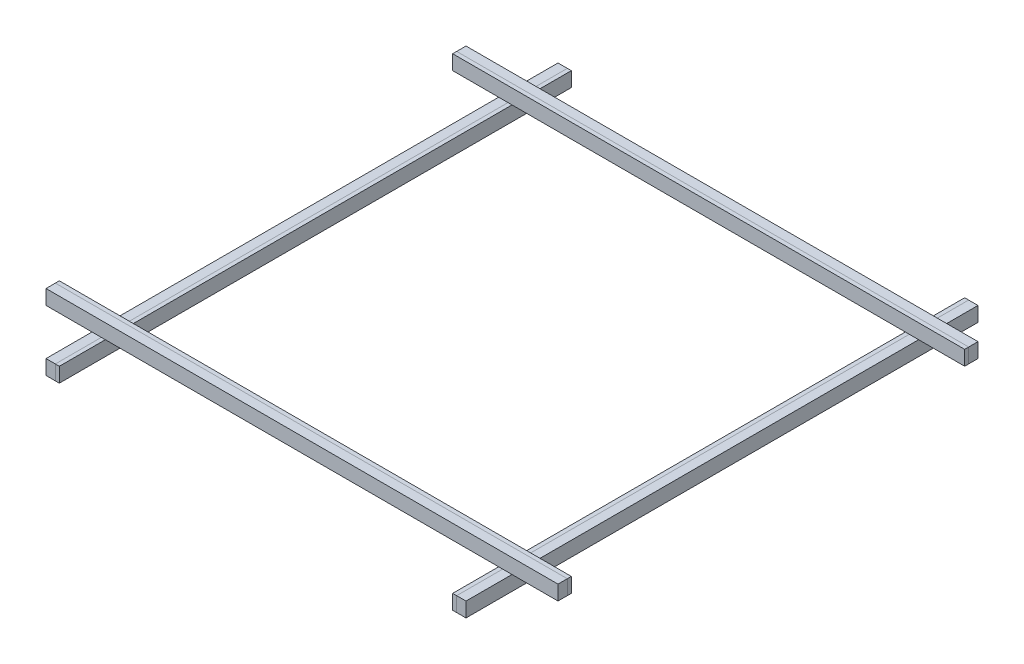
ISO-10303-21;
HEADER;
FILE_DESCRIPTION(('STEP AP214'),'2;1');
FILE_NAME('part.step','',(''),(''),'','','');
FILE_SCHEMA(('AUTOMOTIVE_DESIGN { 1 0 10303 214 1 1 1 1 }'));
ENDSEC;
DATA;
#1=APPLICATION_CONTEXT('core data for automotive mechanical design processes');
#2=APPLICATION_PROTOCOL_DEFINITION('international standard','automotive_design',2000,#1);
#3=PRODUCT_CONTEXT('',#1,'mechanical');
#4=PRODUCT('Part','Part','',(#3));
#5=PRODUCT_RELATED_PRODUCT_CATEGORY('part','',(#4));
#6=PRODUCT_DEFINITION_FORMATION('','',#4);
#7=PRODUCT_DEFINITION_CONTEXT('part definition',#1,'design');
#8=PRODUCT_DEFINITION('design','',#6,#7);
#9=PRODUCT_DEFINITION_SHAPE('','',#8);
#10=(LENGTH_UNIT() NAMED_UNIT(*) SI_UNIT(.MILLI.,.METRE.));
#11=(NAMED_UNIT(*) PLANE_ANGLE_UNIT() SI_UNIT($,.RADIAN.));
#12=(NAMED_UNIT(*) SI_UNIT($,.STERADIAN.) SOLID_ANGLE_UNIT());
#13=UNCERTAINTY_MEASURE_WITH_UNIT(LENGTH_MEASURE(1.E-05),#10,'distance_accuracy_value','');
#14=(GEOMETRIC_REPRESENTATION_CONTEXT(3) GLOBAL_UNCERTAINTY_ASSIGNED_CONTEXT((#13)) GLOBAL_UNIT_ASSIGNED_CONTEXT((#10,
#11,#12)) REPRESENTATION_CONTEXT('',''));
#15=CARTESIAN_POINT('',(0.,0.,0.));
#16=DIRECTION('',(0.,0.,1.));
#17=DIRECTION('',(1.,0.,0.));
#18=AXIS2_PLACEMENT_3D('',#15,#16,#17);
#19=CARTESIAN_POINT('',(3911.6,0.,-4876.8));
#20=DIRECTION('',(0.,0.,-1.));
#21=DIRECTION('',(-1.,0.,0.));
#22=AXIS2_PLACEMENT_3D('',#19,#20,#21);
#23=PLANE('',#22);
#24=DIRECTION('',(0.,1.,0.));
#25=VECTOR('',#24,1.);
#26=CARTESIAN_POINT('',(4044.95,-69.85,-4876.8));
#27=LINE('',#26,#25);
#28=CARTESIAN_POINT('',(4044.95,-69.85,-4876.8));
#29=VERTEX_POINT('',#28);
#30=CARTESIAN_POINT('',(4044.95,69.85,-4876.8));
#31=VERTEX_POINT('',#30);
#32=EDGE_CURVE('E91',#29,#31,#27,.T.);
#33=ORIENTED_EDGE('',*,*,#32,.F.);
#34=DIRECTION('',(1.,0.,0.));
#35=VECTOR('',#34,1.);
#36=CARTESIAN_POINT('',(4044.95,-69.85,-4876.8));
#37=LINE('',#36,#35);
#38=CARTESIAN_POINT('',(4006.85,-69.85,-4876.8));
#39=VERTEX_POINT('',#38);
#40=EDGE_CURVE('E115',#39,#29,#37,.T.);
#41=ORIENTED_EDGE('',*,*,#40,.F.);
#42=DIRECTION('',(0.,-1.,0.));
#43=VECTOR('',#42,1.);
#44=CARTESIAN_POINT('',(4006.85,-69.85,-4876.8));
#45=LINE('',#44,#43);
#46=CARTESIAN_POINT('',(4006.85,69.85,-4876.8));
#47=VERTEX_POINT('',#46);
#48=EDGE_CURVE('E134',#47,#39,#45,.T.);
#49=ORIENTED_EDGE('',*,*,#48,.F.);
#50=DIRECTION('',(-1.,0.,0.));
#51=VECTOR('',#50,1.);
#52=CARTESIAN_POINT('',(4044.95,69.85,-4876.8));
#53=LINE('',#52,#51);
#54=EDGE_CURVE('E128',#31,#47,#53,.T.);
#55=ORIENTED_EDGE('',*,*,#54,.F.);
#56=EDGE_LOOP('',(#33,#41,#49,#55));
#57=FACE_BOUND('',#56,.T.);
#58=ADVANCED_FACE('F72',(#57),#23,.T.);
#59=CARTESIAN_POINT('',(0.,0.,0.));
#60=DIRECTION('',(0.,0.,1.));
#61=DIRECTION('',(1.,0.,0.));
#62=AXIS2_PLACEMENT_3D('',#59,#60,#61);
#63=PLANE('',#62);
#64=DIRECTION('',(0.,1.,0.));
#65=VECTOR('',#64,1.);
#66=CARTESIAN_POINT('',(4044.95,-69.85,0.));
#67=LINE('',#66,#65);
#68=CARTESIAN_POINT('',(4044.95,-69.85,0.));
#69=VERTEX_POINT('',#68);
#70=CARTESIAN_POINT('',(4044.95,69.85,0.));
#71=VERTEX_POINT('',#70);
#72=EDGE_CURVE('E13',#69,#71,#67,.T.);
#73=ORIENTED_EDGE('',*,*,#72,.T.);
#74=DIRECTION('',(-1.,0.,0.));
#75=VECTOR('',#74,1.);
#76=CARTESIAN_POINT('',(4044.95,69.85,0.));
#77=LINE('',#76,#75);
#78=CARTESIAN_POINT('',(4006.85,69.85,0.));
#79=VERTEX_POINT('',#78);
#80=EDGE_CURVE('E82',#71,#79,#77,.T.);
#81=ORIENTED_EDGE('',*,*,#80,.T.);
#82=DIRECTION('',(0.,-1.,0.));
#83=VECTOR('',#82,1.);
#84=CARTESIAN_POINT('',(4006.85,-69.85,0.));
#85=LINE('',#84,#83);
#86=CARTESIAN_POINT('',(4006.85,-69.85,0.));
#87=VERTEX_POINT('',#86);
#88=EDGE_CURVE('E127',#79,#87,#85,.T.);
#89=ORIENTED_EDGE('',*,*,#88,.T.);
#90=DIRECTION('',(1.,0.,0.));
#91=VECTOR('',#90,1.);
#92=CARTESIAN_POINT('',(4044.95,-69.85,0.));
#93=LINE('',#92,#91);
#94=EDGE_CURVE('E76',#87,#69,#93,.T.);
#95=ORIENTED_EDGE('',*,*,#94,.T.);
#96=EDGE_LOOP('',(#73,#81,#89,#95));
#97=FACE_BOUND('',#96,.T.);
#98=ADVANCED_FACE('F74',(#97),#63,.T.);
#99=CARTESIAN_POINT('',(4044.95,69.85,-5021.60227898759));
#100=DIRECTION('',(0.,1.,0.));
#101=DIRECTION('',(-1.,0.,0.));
#102=AXIS2_PLACEMENT_3D('',#99,#100,#101);
#103=PLANE('',#102);
#104=DIRECTION('',(0.,0.,1.));
#105=VECTOR('',#104,1.);
#106=CARTESIAN_POINT('',(4044.95,69.85,-5021.60227898759));
#107=LINE('',#106,#105);
#108=EDGE_CURVE('E121',#31,#71,#107,.T.);
#109=ORIENTED_EDGE('',*,*,#108,.F.);
#110=ORIENTED_EDGE('',*,*,#54,.T.);
#111=DIRECTION('',(0.,0.,1.));
#112=VECTOR('',#111,1.);
#113=CARTESIAN_POINT('',(4006.85,69.85,-5021.60227898759));
#114=LINE('',#113,#112);
#115=EDGE_CURVE('E130',#47,#79,#114,.T.);
#116=ORIENTED_EDGE('',*,*,#115,.T.);
#117=ORIENTED_EDGE('',*,*,#80,.F.);
#118=EDGE_LOOP('',(#109,#110,#116,#117));
#119=FACE_BOUND('',#118,.T.);
#120=ADVANCED_FACE('F139',(#119),#103,.T.);
#121=CARTESIAN_POINT('',(4006.85,-69.85,-5021.60227898759));
#122=DIRECTION('',(-1.,0.,0.));
#123=DIRECTION('',(0.,0.,1.));
#124=AXIS2_PLACEMENT_3D('',#121,#122,#123);
#125=PLANE('',#124);
#126=ORIENTED_EDGE('',*,*,#115,.F.);
#127=ORIENTED_EDGE('',*,*,#48,.T.);
#128=DIRECTION('',(0.,0.,1.));
#129=VECTOR('',#128,1.);
#130=CARTESIAN_POINT('',(4006.85,-69.85,-5021.60227898759));
#131=LINE('',#130,#129);
#132=EDGE_CURVE('E144',#39,#87,#131,.T.);
#133=ORIENTED_EDGE('',*,*,#132,.T.);
#134=ORIENTED_EDGE('',*,*,#88,.F.);
#135=EDGE_LOOP('',(#126,#127,#133,#134));
#136=FACE_BOUND('',#135,.T.);
#137=ADVANCED_FACE('F143',(#136),#125,.T.);
#138=CARTESIAN_POINT('',(4044.95,-69.85,-5021.60227898759));
#139=DIRECTION('',(0.,-1.,0.));
#140=DIRECTION('',(0.,0.,-1.));
#141=AXIS2_PLACEMENT_3D('',#138,#139,#140);
#142=PLANE('',#141);
#143=ORIENTED_EDGE('',*,*,#132,.F.);
#144=ORIENTED_EDGE('',*,*,#40,.T.);
#145=DIRECTION('',(0.,0.,1.));
#146=VECTOR('',#145,1.);
#147=CARTESIAN_POINT('',(4044.95,-69.85,-5021.60227898759));
#148=LINE('',#147,#146);
#149=EDGE_CURVE('E110',#29,#69,#148,.T.);
#150=ORIENTED_EDGE('',*,*,#149,.T.);
#151=ORIENTED_EDGE('',*,*,#94,.F.);
#152=EDGE_LOOP('',(#143,#144,#150,#151));
#153=FACE_BOUND('',#152,.T.);
#154=ADVANCED_FACE('F113',(#153),#142,.T.);
#155=CARTESIAN_POINT('',(4044.95,-69.85,-5021.60227898759));
#156=DIRECTION('',(1.,0.,0.));
#157=DIRECTION('',(0.,0.,-1.));
#158=AXIS2_PLACEMENT_3D('',#155,#156,#157);
#159=PLANE('',#158);
#160=ORIENTED_EDGE('',*,*,#149,.F.);
#161=ORIENTED_EDGE('',*,*,#32,.T.);
#162=ORIENTED_EDGE('',*,*,#108,.T.);
#163=ORIENTED_EDGE('',*,*,#72,.F.);
#164=EDGE_LOOP('',(#160,#161,#162,#163));
#165=FACE_BOUND('',#164,.T.);
#166=ADVANCED_FACE('F119',(#165),#159,.T.);
#167=CLOSED_SHELL('',(#58,#98,#120,#137,#154,#166));
#168=MANIFOLD_SOLID_BREP('B2',#167);
#169=CARTESIAN_POINT('',(3911.6,0.,-4876.8));
#170=DIRECTION('',(0.,0.,-1.));
#171=DIRECTION('',(-1.,0.,0.));
#172=AXIS2_PLACEMENT_3D('',#169,#170,#171);
#173=PLANE('',#172);
#174=DIRECTION('',(0.,-1.,0.));
#175=VECTOR('',#174,1.);
#176=CARTESIAN_POINT('',(222.25,-69.85,-4876.8));
#177=LINE('',#176,#175);
#178=CARTESIAN_POINT('',(222.25,69.85,-4876.8));
#179=VERTEX_POINT('',#178);
#180=CARTESIAN_POINT('',(222.25,-69.85,-4876.8));
#181=VERTEX_POINT('',#180);
#182=EDGE_CURVE('E231',#179,#181,#177,.T.);
#183=ORIENTED_EDGE('',*,*,#182,.F.);
#184=DIRECTION('',(-1.,0.,0.));
#185=VECTOR('',#184,1.);
#186=CARTESIAN_POINT('',(222.25,69.85,-4876.8));
#187=LINE('',#186,#185);
#188=CARTESIAN_POINT('',(260.35,69.85,-4876.8));
#189=VERTEX_POINT('',#188);
#190=EDGE_CURVE('E254',#189,#179,#187,.T.);
#191=ORIENTED_EDGE('',*,*,#190,.F.);
#192=DIRECTION('',(0.,1.,0.));
#193=VECTOR('',#192,1.);
#194=CARTESIAN_POINT('',(260.35,-69.85,-4876.8));
#195=LINE('',#194,#193);
#196=CARTESIAN_POINT('',(260.35,-69.85,-4876.8));
#197=VERTEX_POINT('',#196);
#198=EDGE_CURVE('E259',#197,#189,#195,.T.);
#199=ORIENTED_EDGE('',*,*,#198,.F.);
#200=DIRECTION('',(1.,0.,0.));
#201=VECTOR('',#200,1.);
#202=CARTESIAN_POINT('',(222.25,-69.85,-4876.8));
#203=LINE('',#202,#201);
#204=EDGE_CURVE('E274',#181,#197,#203,.T.);
#205=ORIENTED_EDGE('',*,*,#204,.F.);
#206=EDGE_LOOP('',(#183,#191,#199,#205));
#207=FACE_BOUND('',#206,.T.);
#208=ADVANCED_FACE('F222',(#207),#173,.T.);
#209=CARTESIAN_POINT('',(0.,0.,0.));
#210=DIRECTION('',(0.,0.,-1.));
#211=DIRECTION('',(-1.,0.,0.));
#212=AXIS2_PLACEMENT_3D('',#209,#210,#211);
#213=PLANE('',#212);
#214=DIRECTION('',(0.,-1.,0.));
#215=VECTOR('',#214,1.);
#216=CARTESIAN_POINT('',(222.25,-69.85,0.));
#217=LINE('',#216,#215);
#218=CARTESIAN_POINT('',(222.25,69.85,0.));
#219=VERTEX_POINT('',#218);
#220=CARTESIAN_POINT('',(222.25,-69.85,0.));
#221=VERTEX_POINT('',#220);
#222=EDGE_CURVE('E284',#219,#221,#217,.T.);
#223=ORIENTED_EDGE('',*,*,#222,.T.);
#224=DIRECTION('',(1.,0.,0.));
#225=VECTOR('',#224,1.);
#226=CARTESIAN_POINT('',(222.25,-69.85,0.));
#227=LINE('',#226,#225);
#228=CARTESIAN_POINT('',(260.35,-69.85,0.));
#229=VERTEX_POINT('',#228);
#230=EDGE_CURVE('E272',#221,#229,#227,.T.);
#231=ORIENTED_EDGE('',*,*,#230,.T.);
#232=DIRECTION('',(0.,1.,0.));
#233=VECTOR('',#232,1.);
#234=CARTESIAN_POINT('',(260.35,-69.85,0.));
#235=LINE('',#234,#233);
#236=CARTESIAN_POINT('',(260.35,69.85,0.));
#237=VERTEX_POINT('',#236);
#238=EDGE_CURVE('E276',#229,#237,#235,.T.);
#239=ORIENTED_EDGE('',*,*,#238,.T.);
#240=DIRECTION('',(-1.,0.,0.));
#241=VECTOR('',#240,1.);
#242=CARTESIAN_POINT('',(222.25,69.85,0.));
#243=LINE('',#242,#241);
#244=EDGE_CURVE('E281',#237,#219,#243,.T.);
#245=ORIENTED_EDGE('',*,*,#244,.T.);
#246=EDGE_LOOP('',(#223,#231,#239,#245));
#247=FACE_BOUND('',#246,.T.);
#248=ADVANCED_FACE('F283',(#247),#213,.F.);
#249=CARTESIAN_POINT('',(222.25,-69.85,-5021.60227898759));
#250=DIRECTION('',(0.,-1.,0.));
#251=DIRECTION('',(0.,0.,-1.));
#252=AXIS2_PLACEMENT_3D('',#249,#250,#251);
#253=PLANE('',#252);
#254=DIRECTION('',(0.,0.,1.));
#255=VECTOR('',#254,1.);
#256=CARTESIAN_POINT('',(222.25,-69.85,-5021.60227898759));
#257=LINE('',#256,#255);
#258=EDGE_CURVE('E70',#181,#221,#257,.T.);
#259=ORIENTED_EDGE('',*,*,#258,.F.);
#260=ORIENTED_EDGE('',*,*,#204,.T.);
#261=DIRECTION('',(0.,0.,1.));
#262=VECTOR('',#261,1.);
#263=CARTESIAN_POINT('',(260.35,-69.85,-5021.60227898759));
#264=LINE('',#263,#262);
#265=EDGE_CURVE('E269',#197,#229,#264,.T.);
#266=ORIENTED_EDGE('',*,*,#265,.T.);
#267=ORIENTED_EDGE('',*,*,#230,.F.);
#268=EDGE_LOOP('',(#259,#260,#266,#267));
#269=FACE_BOUND('',#268,.T.);
#270=ADVANCED_FACE('F270',(#269),#253,.T.);
#271=CARTESIAN_POINT('',(260.35,-69.85,-5021.60227898759));
#272=DIRECTION('',(1.,0.,0.));
#273=DIRECTION('',(0.,1.,0.));
#274=AXIS2_PLACEMENT_3D('',#271,#272,#273);
#275=PLANE('',#274);
#276=ORIENTED_EDGE('',*,*,#265,.F.);
#277=ORIENTED_EDGE('',*,*,#198,.T.);
#278=DIRECTION('',(0.,0.,1.));
#279=VECTOR('',#278,1.);
#280=CARTESIAN_POINT('',(260.35,69.85,-5021.60227898759));
#281=LINE('',#280,#279);
#282=EDGE_CURVE('E264',#189,#237,#281,.T.);
#283=ORIENTED_EDGE('',*,*,#282,.T.);
#284=ORIENTED_EDGE('',*,*,#238,.F.);
#285=EDGE_LOOP('',(#276,#277,#283,#284));
#286=FACE_BOUND('',#285,.T.);
#287=ADVANCED_FACE('F277',(#286),#275,.T.);
#288=CARTESIAN_POINT('',(222.25,69.85,-5021.60227898759));
#289=DIRECTION('',(0.,1.,0.));
#290=DIRECTION('',(0.,0.,1.));
#291=AXIS2_PLACEMENT_3D('',#288,#289,#290);
#292=PLANE('',#291);
#293=ORIENTED_EDGE('',*,*,#282,.F.);
#294=ORIENTED_EDGE('',*,*,#190,.T.);
#295=DIRECTION('',(0.,0.,1.));
#296=VECTOR('',#295,1.);
#297=CARTESIAN_POINT('',(222.25,69.85,-5021.60227898759));
#298=LINE('',#297,#296);
#299=EDGE_CURVE('E291',#179,#219,#298,.T.);
#300=ORIENTED_EDGE('',*,*,#299,.T.);
#301=ORIENTED_EDGE('',*,*,#244,.F.);
#302=EDGE_LOOP('',(#293,#294,#300,#301));
#303=FACE_BOUND('',#302,.T.);
#304=ADVANCED_FACE('F299',(#303),#292,.T.);
#305=CARTESIAN_POINT('',(222.25,-69.85,-5021.60227898759));
#306=DIRECTION('',(-1.,0.,0.));
#307=DIRECTION('',(0.,0.,1.));
#308=AXIS2_PLACEMENT_3D('',#305,#306,#307);
#309=PLANE('',#308);
#310=ORIENTED_EDGE('',*,*,#299,.F.);
#311=ORIENTED_EDGE('',*,*,#182,.T.);
#312=ORIENTED_EDGE('',*,*,#258,.T.);
#313=ORIENTED_EDGE('',*,*,#222,.F.);
#314=EDGE_LOOP('',(#310,#311,#312,#313));
#315=FACE_BOUND('',#314,.T.);
#316=ADVANCED_FACE('F300',(#315),#309,.T.);
#317=CLOSED_SHELL('',(#208,#248,#270,#287,#304,#316));
#318=MANIFOLD_SOLID_BREP('B7',#317);
#319=CARTESIAN_POINT('',(4572.,139.7,-660.399999999999));
#320=DIRECTION('',(1.,0.,0.));
#321=DIRECTION('',(0.,0.,-1.));
#322=AXIS2_PLACEMENT_3D('',#319,#320,#321);
#323=PLANE('',#322);
#324=DIRECTION('',(0.,1.,0.));
#325=VECTOR('',#324,1.);
#326=CARTESIAN_POINT('',(4572.,209.55,-527.049999999999));
#327=LINE('',#326,#325);
#328=CARTESIAN_POINT('',(4572.,69.85,-527.049999999999));
#329=VERTEX_POINT('',#328);
#330=CARTESIAN_POINT('',(4572.,209.55,-527.049999999999));
#331=VERTEX_POINT('',#330);
#332=EDGE_CURVE('E391',#329,#331,#327,.T.);
#333=ORIENTED_EDGE('',*,*,#332,.F.);
#334=DIRECTION('',(0.,0.,1.));
#335=VECTOR('',#334,1.);
#336=CARTESIAN_POINT('',(4572.,69.85,-527.049999999999));
#337=LINE('',#336,#335);
#338=CARTESIAN_POINT('',(4572.,69.85,-565.149999999999));
#339=VERTEX_POINT('',#338);
#340=EDGE_CURVE('E415',#339,#329,#337,.T.);
#341=ORIENTED_EDGE('',*,*,#340,.F.);
#342=DIRECTION('',(0.,-1.,0.));
#343=VECTOR('',#342,1.);
#344=CARTESIAN_POINT('',(4572.,209.55,-565.149999999999));
#345=LINE('',#344,#343);
#346=CARTESIAN_POINT('',(4572.,209.55,-565.149999999999));
#347=VERTEX_POINT('',#346);
#348=EDGE_CURVE('E432',#347,#339,#345,.T.);
#349=ORIENTED_EDGE('',*,*,#348,.F.);
#350=DIRECTION('',(0.,0.,-1.));
#351=VECTOR('',#350,1.);
#352=CARTESIAN_POINT('',(4572.,209.55,-527.049999999999));
#353=LINE('',#352,#351);
#354=EDGE_CURVE('E427',#331,#347,#353,.T.);
#355=ORIENTED_EDGE('',*,*,#354,.F.);
#356=EDGE_LOOP('',(#333,#341,#349,#355));
#357=FACE_BOUND('',#356,.T.);
#358=ADVANCED_FACE('F372',(#357),#323,.T.);
#359=CARTESIAN_POINT('',(-304.8,0.,0.));
#360=DIRECTION('',(1.,0.,0.));
#361=DIRECTION('',(0.,0.,-1.));
#362=AXIS2_PLACEMENT_3D('',#359,#360,#361);
#363=PLANE('',#362);
#364=DIRECTION('',(0.,1.,0.));
#365=VECTOR('',#364,1.);
#366=CARTESIAN_POINT('',(-304.8,209.55,-527.049999999999));
#367=LINE('',#366,#365);
#368=CARTESIAN_POINT('',(-304.8,69.85,-527.049999999999));
#369=VERTEX_POINT('',#368);
#370=CARTESIAN_POINT('',(-304.8,209.55,-527.049999999999));
#371=VERTEX_POINT('',#370);
#372=EDGE_CURVE('E220',#369,#371,#367,.T.);
#373=ORIENTED_EDGE('',*,*,#372,.T.);
#374=DIRECTION('',(0.,0.,-1.));
#375=VECTOR('',#374,1.);
#376=CARTESIAN_POINT('',(-304.8,209.55,-527.049999999999));
#377=LINE('',#376,#375);
#378=CARTESIAN_POINT('',(-304.8,209.55,-565.149999999999));
#379=VERTEX_POINT('',#378);
#380=EDGE_CURVE('E382',#371,#379,#377,.T.);
#381=ORIENTED_EDGE('',*,*,#380,.T.);
#382=DIRECTION('',(0.,-1.,0.));
#383=VECTOR('',#382,1.);
#384=CARTESIAN_POINT('',(-304.8,209.55,-565.149999999999));
#385=LINE('',#384,#383);
#386=CARTESIAN_POINT('',(-304.8,69.85,-565.149999999999));
#387=VERTEX_POINT('',#386);
#388=EDGE_CURVE('E426',#379,#387,#385,.T.);
#389=ORIENTED_EDGE('',*,*,#388,.T.);
#390=DIRECTION('',(0.,0.,1.));
#391=VECTOR('',#390,1.);
#392=CARTESIAN_POINT('',(-304.8,69.85,-527.049999999999));
#393=LINE('',#392,#391);
#394=EDGE_CURVE('E376',#387,#369,#393,.T.);
#395=ORIENTED_EDGE('',*,*,#394,.T.);
#396=EDGE_LOOP('',(#373,#381,#389,#395));
#397=FACE_BOUND('',#396,.T.);
#398=ADVANCED_FACE('F374',(#397),#363,.F.);
#399=CARTESIAN_POINT('',(4716.80227898759,209.55,-527.049999999999));
#400=DIRECTION('',(0.,1.,0.));
#401=DIRECTION('',(0.,0.,1.));
#402=AXIS2_PLACEMENT_3D('',#399,#400,#401);
#403=PLANE('',#402);
#404=DIRECTION('',(-1.,0.,0.));
#405=VECTOR('',#404,1.);
#406=CARTESIAN_POINT('',(4716.80227898759,209.55,-527.049999999999));
#407=LINE('',#406,#405);
#408=EDGE_CURVE('E420',#331,#371,#407,.T.);
#409=ORIENTED_EDGE('',*,*,#408,.F.);
#410=ORIENTED_EDGE('',*,*,#354,.T.);
#411=DIRECTION('',(-1.,0.,0.));
#412=VECTOR('',#411,1.);
#413=CARTESIAN_POINT('',(4716.80227898759,209.55,-565.149999999999));
#414=LINE('',#413,#412);
#415=EDGE_CURVE('E429',#347,#379,#414,.T.);
#416=ORIENTED_EDGE('',*,*,#415,.T.);
#417=ORIENTED_EDGE('',*,*,#380,.F.);
#418=EDGE_LOOP('',(#409,#410,#416,#417));
#419=FACE_BOUND('',#418,.T.);
#420=ADVANCED_FACE('F437',(#419),#403,.T.);
#421=CARTESIAN_POINT('',(4716.80227898759,209.55,-565.149999999999));
#422=DIRECTION('',(0.,0.,-1.));
#423=DIRECTION('',(-1.,0.,0.));
#424=AXIS2_PLACEMENT_3D('',#421,#422,#423);
#425=PLANE('',#424);
#426=ORIENTED_EDGE('',*,*,#415,.F.);
#427=ORIENTED_EDGE('',*,*,#348,.T.);
#428=DIRECTION('',(-1.,0.,0.));
#429=VECTOR('',#428,1.);
#430=CARTESIAN_POINT('',(4716.80227898759,69.85,-565.149999999999));
#431=LINE('',#430,#429);
#432=EDGE_CURVE('E442',#339,#387,#431,.T.);
#433=ORIENTED_EDGE('',*,*,#432,.T.);
#434=ORIENTED_EDGE('',*,*,#388,.F.);
#435=EDGE_LOOP('',(#426,#427,#433,#434));
#436=FACE_BOUND('',#435,.T.);
#437=ADVANCED_FACE('F441',(#436),#425,.T.);
#438=CARTESIAN_POINT('',(4716.80227898759,69.85,-527.049999999999));
#439=DIRECTION('',(0.,-1.,0.));
#440=DIRECTION('',(0.,0.,-1.));
#441=AXIS2_PLACEMENT_3D('',#438,#439,#440);
#442=PLANE('',#441);
#443=ORIENTED_EDGE('',*,*,#432,.F.);
#444=ORIENTED_EDGE('',*,*,#340,.T.);
#445=DIRECTION('',(-1.,0.,0.));
#446=VECTOR('',#445,1.);
#447=CARTESIAN_POINT('',(4716.80227898759,69.85,-527.049999999999));
#448=LINE('',#447,#446);
#449=EDGE_CURVE('E410',#329,#369,#448,.T.);
#450=ORIENTED_EDGE('',*,*,#449,.T.);
#451=ORIENTED_EDGE('',*,*,#394,.F.);
#452=EDGE_LOOP('',(#443,#444,#450,#451));
#453=FACE_BOUND('',#452,.T.);
#454=ADVANCED_FACE('F413',(#453),#442,.T.);
#455=CARTESIAN_POINT('',(4716.80227898759,209.55,-527.049999999999));
#456=DIRECTION('',(0.,0.,1.));
#457=DIRECTION('',(1.,0.,0.));
#458=AXIS2_PLACEMENT_3D('',#455,#456,#457);
#459=PLANE('',#458);
#460=ORIENTED_EDGE('',*,*,#449,.F.);
#461=ORIENTED_EDGE('',*,*,#332,.T.);
#462=ORIENTED_EDGE('',*,*,#408,.T.);
#463=ORIENTED_EDGE('',*,*,#372,.F.);
#464=EDGE_LOOP('',(#460,#461,#462,#463));
#465=FACE_BOUND('',#464,.T.);
#466=ADVANCED_FACE('F418',(#465),#459,.T.);
#467=CLOSED_SHELL('',(#358,#398,#420,#437,#454,#466));
#468=MANIFOLD_SOLID_BREP('B64',#467);
#469=CARTESIAN_POINT('',(4572.,139.7,-660.399999999999));
#470=DIRECTION('',(1.,0.,0.));
#471=DIRECTION('',(0.,0.,-1.));
#472=AXIS2_PLACEMENT_3D('',#469,#470,#471);
#473=PLANE('',#472);
#474=DIRECTION('',(0.,-1.,0.));
#475=VECTOR('',#474,1.);
#476=CARTESIAN_POINT('',(4572.,209.55,-4349.75));
#477=LINE('',#476,#475);
#478=CARTESIAN_POINT('',(4572.,209.55,-4349.75));
#479=VERTEX_POINT('',#478);
#480=CARTESIAN_POINT('',(4572.,69.85,-4349.75));
#481=VERTEX_POINT('',#480);
#482=EDGE_CURVE('E527',#479,#481,#477,.T.);
#483=ORIENTED_EDGE('',*,*,#482,.F.);
#484=DIRECTION('',(0.,0.,-1.));
#485=VECTOR('',#484,1.);
#486=CARTESIAN_POINT('',(4572.,209.55,-4349.75));
#487=LINE('',#486,#485);
#488=CARTESIAN_POINT('',(4572.,209.55,-4311.65));
#489=VERTEX_POINT('',#488);
#490=EDGE_CURVE('E554',#489,#479,#487,.T.);
#491=ORIENTED_EDGE('',*,*,#490,.F.);
#492=DIRECTION('',(0.,1.,0.));
#493=VECTOR('',#492,1.);
#494=CARTESIAN_POINT('',(4572.,209.55,-4311.65));
#495=LINE('',#494,#493);
#496=CARTESIAN_POINT('',(4572.,69.85,-4311.65));
#497=VERTEX_POINT('',#496);
#498=EDGE_CURVE('E559',#497,#489,#495,.T.);
#499=ORIENTED_EDGE('',*,*,#498,.F.);
#500=DIRECTION('',(0.,0.,1.));
#501=VECTOR('',#500,1.);
#502=CARTESIAN_POINT('',(4572.,69.85,-4349.75));
#503=LINE('',#502,#501);
#504=EDGE_CURVE('E574',#481,#497,#503,.T.);
#505=ORIENTED_EDGE('',*,*,#504,.F.);
#506=EDGE_LOOP('',(#483,#491,#499,#505));
#507=FACE_BOUND('',#506,.T.);
#508=ADVANCED_FACE('F518',(#507),#473,.T.);
#509=CARTESIAN_POINT('',(-304.8,0.,0.));
#510=DIRECTION('',(-1.,0.,0.));
#511=DIRECTION('',(0.,0.,1.));
#512=AXIS2_PLACEMENT_3D('',#509,#510,#511);
#513=PLANE('',#512);
#514=DIRECTION('',(0.,-1.,0.));
#515=VECTOR('',#514,1.);
#516=CARTESIAN_POINT('',(-304.8,209.55,-4349.75));
#517=LINE('',#516,#515);
#518=CARTESIAN_POINT('',(-304.8,209.55,-4349.75));
#519=VERTEX_POINT('',#518);
#520=CARTESIAN_POINT('',(-304.8,69.85,-4349.75));
#521=VERTEX_POINT('',#520);
#522=EDGE_CURVE('E585',#519,#521,#517,.T.);
#523=ORIENTED_EDGE('',*,*,#522,.T.);
#524=DIRECTION('',(0.,0.,1.));
#525=VECTOR('',#524,1.);
#526=CARTESIAN_POINT('',(-304.8,69.85,-4349.75));
#527=LINE('',#526,#525);
#528=CARTESIAN_POINT('',(-304.8,69.85,-4311.65));
#529=VERTEX_POINT('',#528);
#530=EDGE_CURVE('E572',#521,#529,#527,.T.);
#531=ORIENTED_EDGE('',*,*,#530,.T.);
#532=DIRECTION('',(0.,1.,0.));
#533=VECTOR('',#532,1.);
#534=CARTESIAN_POINT('',(-304.8,209.55,-4311.65));
#535=LINE('',#534,#533);
#536=CARTESIAN_POINT('',(-304.8,209.55,-4311.65));
#537=VERTEX_POINT('',#536);
#538=EDGE_CURVE('E576',#529,#537,#535,.T.);
#539=ORIENTED_EDGE('',*,*,#538,.T.);
#540=DIRECTION('',(0.,0.,-1.));
#541=VECTOR('',#540,1.);
#542=CARTESIAN_POINT('',(-304.8,209.55,-4349.75));
#543=LINE('',#542,#541);
#544=EDGE_CURVE('E582',#537,#519,#543,.T.);
#545=ORIENTED_EDGE('',*,*,#544,.T.);
#546=EDGE_LOOP('',(#523,#531,#539,#545));
#547=FACE_BOUND('',#546,.T.);
#548=ADVANCED_FACE('F584',(#547),#513,.T.);
#549=CARTESIAN_POINT('',(4716.80227898759,69.85,-4349.75));
#550=DIRECTION('',(0.,-1.,0.));
#551=DIRECTION('',(0.,0.,-1.));
#552=AXIS2_PLACEMENT_3D('',#549,#550,#551);
#553=PLANE('',#552);
#554=DIRECTION('',(-1.,0.,0.));
#555=VECTOR('',#554,1.);
#556=CARTESIAN_POINT('',(4716.80227898759,69.85,-4349.75));
#557=LINE('',#556,#555);
#558=EDGE_CURVE('E370',#481,#521,#557,.T.);
#559=ORIENTED_EDGE('',*,*,#558,.F.);
#560=ORIENTED_EDGE('',*,*,#504,.T.);
#561=DIRECTION('',(-1.,0.,0.));
#562=VECTOR('',#561,1.);
#563=CARTESIAN_POINT('',(4716.80227898759,69.85,-4311.65));
#564=LINE('',#563,#562);
#565=EDGE_CURVE('E569',#497,#529,#564,.T.);
#566=ORIENTED_EDGE('',*,*,#565,.T.);
#567=ORIENTED_EDGE('',*,*,#530,.F.);
#568=EDGE_LOOP('',(#559,#560,#566,#567));
#569=FACE_BOUND('',#568,.T.);
#570=ADVANCED_FACE('F570',(#569),#553,.T.);
#571=CARTESIAN_POINT('',(4716.80227898759,209.55,-4311.65));
#572=DIRECTION('',(0.,0.,1.));
#573=DIRECTION('',(1.,0.,0.));
#574=AXIS2_PLACEMENT_3D('',#571,#572,#573);
#575=PLANE('',#574);
#576=ORIENTED_EDGE('',*,*,#565,.F.);
#577=ORIENTED_EDGE('',*,*,#498,.T.);
#578=DIRECTION('',(-1.,0.,0.));
#579=VECTOR('',#578,1.);
#580=CARTESIAN_POINT('',(4716.80227898759,209.55,-4311.65));
#581=LINE('',#580,#579);
#582=EDGE_CURVE('E564',#489,#537,#581,.T.);
#583=ORIENTED_EDGE('',*,*,#582,.T.);
#584=ORIENTED_EDGE('',*,*,#538,.F.);
#585=EDGE_LOOP('',(#576,#577,#583,#584));
#586=FACE_BOUND('',#585,.T.);
#587=ADVANCED_FACE('F577',(#586),#575,.T.);
#588=CARTESIAN_POINT('',(4716.80227898759,209.55,-4349.75));
#589=DIRECTION('',(0.,1.,0.));
#590=DIRECTION('',(0.,0.,1.));
#591=AXIS2_PLACEMENT_3D('',#588,#589,#590);
#592=PLANE('',#591);
#593=ORIENTED_EDGE('',*,*,#582,.F.);
#594=ORIENTED_EDGE('',*,*,#490,.T.);
#595=DIRECTION('',(-1.,0.,0.));
#596=VECTOR('',#595,1.);
#597=CARTESIAN_POINT('',(4716.80227898759,209.55,-4349.75));
#598=LINE('',#597,#596);
#599=EDGE_CURVE('E595',#479,#519,#598,.T.);
#600=ORIENTED_EDGE('',*,*,#599,.T.);
#601=ORIENTED_EDGE('',*,*,#544,.F.);
#602=EDGE_LOOP('',(#593,#594,#600,#601));
#603=FACE_BOUND('',#602,.T.);
#604=ADVANCED_FACE('F605',(#603),#592,.T.);
#605=CARTESIAN_POINT('',(4716.80227898759,209.55,-4349.75));
#606=DIRECTION('',(0.,0.,-1.));
#607=DIRECTION('',(-1.,0.,0.));
#608=AXIS2_PLACEMENT_3D('',#605,#606,#607);
#609=PLANE('',#608);
#610=ORIENTED_EDGE('',*,*,#599,.F.);
#611=ORIENTED_EDGE('',*,*,#482,.T.);
#612=ORIENTED_EDGE('',*,*,#558,.T.);
#613=ORIENTED_EDGE('',*,*,#522,.F.);
#614=EDGE_LOOP('',(#610,#611,#612,#613));
#615=FACE_BOUND('',#614,.T.);
#616=ADVANCED_FACE('F606',(#615),#609,.T.);
#617=CLOSED_SHELL('',(#508,#548,#570,#587,#604,#616));
#618=MANIFOLD_SOLID_BREP('B214',#617);
#619=CARTESIAN_POINT('',(4572.,209.55,-527.049999999999));
#620=DIRECTION('',(0.,0.,1.));
#621=DIRECTION('',(1.,0.,0.));
#622=AXIS2_PLACEMENT_3D('',#619,#620,#621);
#623=PLANE('',#622);
#624=DIRECTION('',(0.,1.,0.));
#625=VECTOR('',#624,1.);
#626=CARTESIAN_POINT('',(-304.8,209.55,-527.049999999999));
#627=LINE('',#626,#625);
#628=CARTESIAN_POINT('',(-304.8,69.85,-527.049999999999));
#629=VERTEX_POINT('',#628);
#630=CARTESIAN_POINT('',(-304.8,209.55,-527.049999999999));
#631=VERTEX_POINT('',#630);
#632=EDGE_CURVE('E743',#629,#631,#627,.T.);
#633=ORIENTED_EDGE('',*,*,#632,.T.);
#634=DIRECTION('',(-1.,0.,0.));
#635=VECTOR('',#634,1.);
#636=CARTESIAN_POINT('',(4572.,209.55,-527.049999999999));
#637=LINE('',#636,#635);
#638=CARTESIAN_POINT('',(4572.,209.55,-527.049999999999));
#639=VERTEX_POINT('',#638);
#640=EDGE_CURVE('E516',#639,#631,#637,.T.);
#641=ORIENTED_EDGE('',*,*,#640,.F.);
#642=DIRECTION('',(0.,1.,0.));
#643=VECTOR('',#642,1.);
#644=CARTESIAN_POINT('',(4572.,209.55,-527.049999999999));
#645=LINE('',#644,#643);
#646=CARTESIAN_POINT('',(4572.,69.85,-527.049999999999));
#647=VERTEX_POINT('',#646);
#648=EDGE_CURVE('E731',#647,#639,#645,.T.);
#649=ORIENTED_EDGE('',*,*,#648,.F.);
#650=DIRECTION('',(-1.,0.,0.));
#651=VECTOR('',#650,1.);
#652=CARTESIAN_POINT('',(4572.,69.85,-527.049999999999));
#653=LINE('',#652,#651);
#654=EDGE_CURVE('E739',#647,#629,#653,.T.);
#655=ORIENTED_EDGE('',*,*,#654,.T.);
#656=EDGE_LOOP('',(#633,#641,#649,#655));
#657=FACE_BOUND('',#656,.T.);
#658=ADVANCED_FACE('F680',(#657),#623,.F.);
#659=CARTESIAN_POINT('',(4572.,209.55,-438.149999999999));
#660=DIRECTION('',(0.,-1.,0.));
#661=DIRECTION('',(0.,0.,-1.));
#662=AXIS2_PLACEMENT_3D('',#659,#660,#661);
#663=PLANE('',#662);
#664=DIRECTION('',(0.,0.,1.));
#665=VECTOR('',#664,1.);
#666=CARTESIAN_POINT('',(-304.8,209.55,-438.149999999999));
#667=LINE('',#666,#665);
#668=CARTESIAN_POINT('',(-304.8,209.55,-438.149999999999));
#669=VERTEX_POINT('',#668);
#670=EDGE_CURVE('E735',#631,#669,#667,.T.);
#671=ORIENTED_EDGE('',*,*,#670,.T.);
#672=DIRECTION('',(-1.,0.,0.));
#673=VECTOR('',#672,1.);
#674=CARTESIAN_POINT('',(4572.,209.55,-438.149999999999));
#675=LINE('',#674,#673);
#676=CARTESIAN_POINT('',(4572.,209.55,-438.149999999999));
#677=VERTEX_POINT('',#676);
#678=EDGE_CURVE('E688',#677,#669,#675,.T.);
#679=ORIENTED_EDGE('',*,*,#678,.F.);
#680=DIRECTION('',(0.,0.,1.));
#681=VECTOR('',#680,1.);
#682=CARTESIAN_POINT('',(4572.,209.55,-438.149999999999));
#683=LINE('',#682,#681);
#684=EDGE_CURVE('E726',#639,#677,#683,.T.);
#685=ORIENTED_EDGE('',*,*,#684,.F.);
#686=ORIENTED_EDGE('',*,*,#640,.T.);
#687=EDGE_LOOP('',(#671,#679,#685,#686));
#688=FACE_BOUND('',#687,.T.);
#689=ADVANCED_FACE('F734',(#688),#663,.F.);
#690=CARTESIAN_POINT('',(4572.,209.55,-438.149999999999));
#691=DIRECTION('',(0.,0.,-1.));
#692=DIRECTION('',(-1.,0.,0.));
#693=AXIS2_PLACEMENT_3D('',#690,#691,#692);
#694=PLANE('',#693);
#695=DIRECTION('',(0.,-1.,0.));
#696=VECTOR('',#695,1.);
#697=CARTESIAN_POINT('',(-304.8,209.55,-438.149999999999));
#698=LINE('',#697,#696);
#699=CARTESIAN_POINT('',(-304.8,69.85,-438.149999999999));
#700=VERTEX_POINT('',#699);
#701=EDGE_CURVE('E713',#669,#700,#698,.T.);
#702=ORIENTED_EDGE('',*,*,#701,.T.);
#703=DIRECTION('',(-1.,0.,0.));
#704=VECTOR('',#703,1.);
#705=CARTESIAN_POINT('',(4572.,69.85,-438.149999999999));
#706=LINE('',#705,#704);
#707=CARTESIAN_POINT('',(4572.,69.85,-438.149999999999));
#708=VERTEX_POINT('',#707);
#709=EDGE_CURVE('E736',#708,#700,#706,.T.);
#710=ORIENTED_EDGE('',*,*,#709,.F.);
#711=DIRECTION('',(0.,-1.,0.));
#712=VECTOR('',#711,1.);
#713=CARTESIAN_POINT('',(4572.,209.55,-438.149999999999));
#714=LINE('',#713,#712);
#715=EDGE_CURVE('E729',#677,#708,#714,.T.);
#716=ORIENTED_EDGE('',*,*,#715,.F.);
#717=ORIENTED_EDGE('',*,*,#678,.T.);
#718=EDGE_LOOP('',(#702,#710,#716,#717));
#719=FACE_BOUND('',#718,.T.);
#720=ADVANCED_FACE('F737',(#719),#694,.F.);
#721=CARTESIAN_POINT('',(4572.,69.85,-438.149999999999));
#722=DIRECTION('',(0.,1.,0.));
#723=DIRECTION('',(0.,0.,1.));
#724=AXIS2_PLACEMENT_3D('',#721,#722,#723);
#725=PLANE('',#724);
#726=DIRECTION('',(0.,0.,-1.));
#727=VECTOR('',#726,1.);
#728=CARTESIAN_POINT('',(-304.8,69.85,-438.149999999999));
#729=LINE('',#728,#727);
#730=EDGE_CURVE('E719',#700,#629,#729,.T.);
#731=ORIENTED_EDGE('',*,*,#730,.T.);
#732=ORIENTED_EDGE('',*,*,#654,.F.);
#733=DIRECTION('',(0.,0.,-1.));
#734=VECTOR('',#733,1.);
#735=CARTESIAN_POINT('',(4572.,69.85,-438.149999999999));
#736=LINE('',#735,#734);
#737=EDGE_CURVE('E696',#708,#647,#736,.T.);
#738=ORIENTED_EDGE('',*,*,#737,.F.);
#739=ORIENTED_EDGE('',*,*,#709,.T.);
#740=EDGE_LOOP('',(#731,#732,#738,#739));
#741=FACE_BOUND('',#740,.T.);
#742=ADVANCED_FACE('F750',(#741),#725,.F.);
#743=CARTESIAN_POINT('',(4572.,139.7,-660.399999999999));
#744=DIRECTION('',(1.,0.,0.));
#745=DIRECTION('',(0.,0.,-1.));
#746=AXIS2_PLACEMENT_3D('',#743,#744,#745);
#747=PLANE('',#746);
#748=ORIENTED_EDGE('',*,*,#648,.T.);
#749=ORIENTED_EDGE('',*,*,#684,.T.);
#750=ORIENTED_EDGE('',*,*,#715,.T.);
#751=ORIENTED_EDGE('',*,*,#737,.T.);
#752=EDGE_LOOP('',(#748,#749,#750,#751));
#753=FACE_BOUND('',#752,.T.);
#754=ADVANCED_FACE('F727',(#753),#747,.T.);
#755=CARTESIAN_POINT('',(-304.8,139.7,-660.399999999999));
#756=DIRECTION('',(1.,0.,0.));
#757=DIRECTION('',(0.,0.,-1.));
#758=AXIS2_PLACEMENT_3D('',#755,#756,#757);
#759=PLANE('',#758);
#760=ORIENTED_EDGE('',*,*,#632,.F.);
#761=ORIENTED_EDGE('',*,*,#730,.F.);
#762=ORIENTED_EDGE('',*,*,#701,.F.);
#763=ORIENTED_EDGE('',*,*,#670,.F.);
#764=EDGE_LOOP('',(#760,#761,#762,#763));
#765=FACE_BOUND('',#764,.T.);
#766=ADVANCED_FACE('F753',(#765),#759,.F.);
#767=CLOSED_SHELL('',(#658,#689,#720,#742,#754,#766));
#768=MANIFOLD_SOLID_BREP('B364',#767);
#769=CARTESIAN_POINT('',(4572.,209.55,-4438.65));
#770=DIRECTION('',(0.,0.,1.));
#771=DIRECTION('',(1.,0.,0.));
#772=AXIS2_PLACEMENT_3D('',#769,#770,#771);
#773=PLANE('',#772);
#774=DIRECTION('',(0.,1.,0.));
#775=VECTOR('',#774,1.);
#776=CARTESIAN_POINT('',(-304.8,209.55,-4438.65));
#777=LINE('',#776,#775);
#778=CARTESIAN_POINT('',(-304.8,69.85,-4438.65));
#779=VERTEX_POINT('',#778);
#780=CARTESIAN_POINT('',(-304.8,209.55,-4438.65));
#781=VERTEX_POINT('',#780);
#782=EDGE_CURVE('E910',#779,#781,#777,.T.);
#783=ORIENTED_EDGE('',*,*,#782,.T.);
#784=DIRECTION('',(-1.,0.,0.));
#785=VECTOR('',#784,1.);
#786=CARTESIAN_POINT('',(4572.,209.55,-4438.65));
#787=LINE('',#786,#785);
#788=CARTESIAN_POINT('',(4572.,209.55,-4438.65));
#789=VERTEX_POINT('',#788);
#790=EDGE_CURVE('E678',#789,#781,#787,.T.);
#791=ORIENTED_EDGE('',*,*,#790,.F.);
#792=DIRECTION('',(0.,1.,0.));
#793=VECTOR('',#792,1.);
#794=CARTESIAN_POINT('',(4572.,209.55,-4438.65));
#795=LINE('',#794,#793);
#796=CARTESIAN_POINT('',(4572.,69.85,-4438.65));
#797=VERTEX_POINT('',#796);
#798=EDGE_CURVE('E893',#797,#789,#795,.T.);
#799=ORIENTED_EDGE('',*,*,#798,.F.);
#800=DIRECTION('',(-1.,0.,0.));
#801=VECTOR('',#800,1.);
#802=CARTESIAN_POINT('',(4572.,69.85,-4438.65));
#803=LINE('',#802,#801);
#804=EDGE_CURVE('E906',#797,#779,#803,.T.);
#805=ORIENTED_EDGE('',*,*,#804,.T.);
#806=EDGE_LOOP('',(#783,#791,#799,#805));
#807=FACE_BOUND('',#806,.T.);
#808=ADVANCED_FACE('F837',(#807),#773,.F.);
#809=CARTESIAN_POINT('',(4572.,209.55,-4349.75));
#810=DIRECTION('',(0.,-1.,0.));
#811=DIRECTION('',(0.,0.,-1.));
#812=AXIS2_PLACEMENT_3D('',#809,#810,#811);
#813=PLANE('',#812);
#814=DIRECTION('',(0.,0.,1.));
#815=VECTOR('',#814,1.);
#816=CARTESIAN_POINT('',(-304.8,209.55,-4349.75));
#817=LINE('',#816,#815);
#818=CARTESIAN_POINT('',(-304.8,209.55,-4349.75));
#819=VERTEX_POINT('',#818);
#820=EDGE_CURVE('E898',#781,#819,#817,.T.);
#821=ORIENTED_EDGE('',*,*,#820,.T.);
#822=DIRECTION('',(-1.,0.,0.));
#823=VECTOR('',#822,1.);
#824=CARTESIAN_POINT('',(4572.,209.55,-4349.75));
#825=LINE('',#824,#823);
#826=CARTESIAN_POINT('',(4572.,209.55,-4349.75));
#827=VERTEX_POINT('',#826);
#828=EDGE_CURVE('E846',#827,#819,#825,.T.);
#829=ORIENTED_EDGE('',*,*,#828,.F.);
#830=DIRECTION('',(0.,0.,1.));
#831=VECTOR('',#830,1.);
#832=CARTESIAN_POINT('',(4572.,209.55,-4349.75));
#833=LINE('',#832,#831);
#834=EDGE_CURVE('E888',#789,#827,#833,.T.);
#835=ORIENTED_EDGE('',*,*,#834,.F.);
#836=ORIENTED_EDGE('',*,*,#790,.T.);
#837=EDGE_LOOP('',(#821,#829,#835,#836));
#838=FACE_BOUND('',#837,.T.);
#839=ADVANCED_FACE('F897',(#838),#813,.F.);
#840=CARTESIAN_POINT('',(4572.,209.55,-4349.75));
#841=DIRECTION('',(0.,0.,-1.));
#842=DIRECTION('',(-1.,0.,0.));
#843=AXIS2_PLACEMENT_3D('',#840,#841,#842);
#844=PLANE('',#843);
#845=DIRECTION('',(0.,-1.,0.));
#846=VECTOR('',#845,1.);
#847=CARTESIAN_POINT('',(-304.8,209.55,-4349.75));
#848=LINE('',#847,#846);
#849=CARTESIAN_POINT('',(-304.8,69.85,-4349.75));
#850=VERTEX_POINT('',#849);
#851=EDGE_CURVE('E874',#819,#850,#848,.T.);
#852=ORIENTED_EDGE('',*,*,#851,.T.);
#853=DIRECTION('',(-1.,0.,0.));
#854=VECTOR('',#853,1.);
#855=CARTESIAN_POINT('',(4572.,69.85,-4349.75));
#856=LINE('',#855,#854);
#857=CARTESIAN_POINT('',(4572.,69.85,-4349.75));
#858=VERTEX_POINT('',#857);
#859=EDGE_CURVE('E900',#858,#850,#856,.T.);
#860=ORIENTED_EDGE('',*,*,#859,.F.);
#861=DIRECTION('',(0.,-1.,0.));
#862=VECTOR('',#861,1.);
#863=CARTESIAN_POINT('',(4572.,209.55,-4349.75));
#864=LINE('',#863,#862);
#865=EDGE_CURVE('E891',#827,#858,#864,.T.);
#866=ORIENTED_EDGE('',*,*,#865,.F.);
#867=ORIENTED_EDGE('',*,*,#828,.T.);
#868=EDGE_LOOP('',(#852,#860,#866,#867));
#869=FACE_BOUND('',#868,.T.);
#870=ADVANCED_FACE('F901',(#869),#844,.F.);
#871=CARTESIAN_POINT('',(4572.,69.85,-4349.75));
#872=DIRECTION('',(0.,1.,0.));
#873=DIRECTION('',(0.,0.,1.));
#874=AXIS2_PLACEMENT_3D('',#871,#872,#873);
#875=PLANE('',#874);
#876=DIRECTION('',(0.,0.,-1.));
#877=VECTOR('',#876,1.);
#878=CARTESIAN_POINT('',(-304.8,69.85,-4349.75));
#879=LINE('',#878,#877);
#880=EDGE_CURVE('E880',#850,#779,#879,.T.);
#881=ORIENTED_EDGE('',*,*,#880,.T.);
#882=ORIENTED_EDGE('',*,*,#804,.F.);
#883=DIRECTION('',(0.,0.,-1.));
#884=VECTOR('',#883,1.);
#885=CARTESIAN_POINT('',(4572.,69.85,-4349.75));
#886=LINE('',#885,#884);
#887=EDGE_CURVE('E857',#858,#797,#886,.T.);
#888=ORIENTED_EDGE('',*,*,#887,.F.);
#889=ORIENTED_EDGE('',*,*,#859,.T.);
#890=EDGE_LOOP('',(#881,#882,#888,#889));
#891=FACE_BOUND('',#890,.T.);
#892=ADVANCED_FACE('F920',(#891),#875,.F.);
#893=CARTESIAN_POINT('',(4572.,139.7,-4572.));
#894=DIRECTION('',(1.,0.,0.));
#895=DIRECTION('',(0.,0.,-1.));
#896=AXIS2_PLACEMENT_3D('',#893,#894,#895);
#897=PLANE('',#896);
#898=ORIENTED_EDGE('',*,*,#798,.T.);
#899=ORIENTED_EDGE('',*,*,#834,.T.);
#900=ORIENTED_EDGE('',*,*,#865,.T.);
#901=ORIENTED_EDGE('',*,*,#887,.T.);
#902=EDGE_LOOP('',(#898,#899,#900,#901));
#903=FACE_BOUND('',#902,.T.);
#904=ADVANCED_FACE('F889',(#903),#897,.T.);
#905=CARTESIAN_POINT('',(-304.8,139.7,-4572.));
#906=DIRECTION('',(1.,0.,0.));
#907=DIRECTION('',(0.,0.,-1.));
#908=AXIS2_PLACEMENT_3D('',#905,#906,#907);
#909=PLANE('',#908);
#910=ORIENTED_EDGE('',*,*,#782,.F.);
#911=ORIENTED_EDGE('',*,*,#880,.F.);
#912=ORIENTED_EDGE('',*,*,#851,.F.);
#913=ORIENTED_EDGE('',*,*,#820,.F.);
#914=EDGE_LOOP('',(#910,#911,#912,#913));
#915=FACE_BOUND('',#914,.T.);
#916=ADVANCED_FACE('F923',(#915),#909,.F.);
#917=CLOSED_SHELL('',(#808,#839,#870,#892,#904,#916));
#918=MANIFOLD_SOLID_BREP('B510',#917);
#919=CARTESIAN_POINT('',(4044.95,69.85,-4876.8));
#920=DIRECTION('',(1.,0.,0.));
#921=DIRECTION('',(0.,0.,-1.));
#922=AXIS2_PLACEMENT_3D('',#919,#920,#921);
#923=PLANE('',#922);
#924=DIRECTION('',(0.,1.,0.));
#925=VECTOR('',#924,1.);
#926=CARTESIAN_POINT('',(4044.95,69.85,0.));
#927=LINE('',#926,#925);
#928=CARTESIAN_POINT('',(4044.95,-69.85,0.));
#929=VERTEX_POINT('',#928);
#930=CARTESIAN_POINT('',(4044.95,69.85,0.));
#931=VERTEX_POINT('',#930);
#932=EDGE_CURVE('E1074',#929,#931,#927,.T.);
#933=ORIENTED_EDGE('',*,*,#932,.T.);
#934=DIRECTION('',(0.,0.,1.));
#935=VECTOR('',#934,1.);
#936=CARTESIAN_POINT('',(4044.95,69.85,-4876.8));
#937=LINE('',#936,#935);
#938=CARTESIAN_POINT('',(4044.95,69.85,-4876.8));
#939=VERTEX_POINT('',#938);
#940=EDGE_CURVE('E835',#939,#931,#937,.T.);
#941=ORIENTED_EDGE('',*,*,#940,.F.);
#942=DIRECTION('',(0.,1.,0.));
#943=VECTOR('',#942,1.);
#944=CARTESIAN_POINT('',(4044.95,69.85,-4876.8));
#945=LINE('',#944,#943);
#946=CARTESIAN_POINT('',(4044.95,-69.85,-4876.8));
#947=VERTEX_POINT('',#946);
#948=EDGE_CURVE('E1061',#947,#939,#945,.T.);
#949=ORIENTED_EDGE('',*,*,#948,.F.);
#950=DIRECTION('',(0.,0.,1.));
#951=VECTOR('',#950,1.);
#952=CARTESIAN_POINT('',(4044.95,-69.85,-4876.8));
#953=LINE('',#952,#951);
#954=EDGE_CURVE('E1070',#947,#929,#953,.T.);
#955=ORIENTED_EDGE('',*,*,#954,.T.);
#956=EDGE_LOOP('',(#933,#941,#949,#955));
#957=FACE_BOUND('',#956,.T.);
#958=ADVANCED_FACE('F1009',(#957),#923,.F.);
#959=CARTESIAN_POINT('',(4133.85,69.85,-4876.8));
#960=DIRECTION('',(0.,-1.,0.));
#961=DIRECTION('',(0.,0.,-1.));
#962=AXIS2_PLACEMENT_3D('',#959,#960,#961);
#963=PLANE('',#962);
#964=DIRECTION('',(1.,0.,0.));
#965=VECTOR('',#964,1.);
#966=CARTESIAN_POINT('',(4133.85,69.85,0.));
#967=LINE('',#966,#965);
#968=CARTESIAN_POINT('',(4133.85,69.85,0.));
#969=VERTEX_POINT('',#968);
#970=EDGE_CURVE('E1065',#931,#969,#967,.T.);
#971=ORIENTED_EDGE('',*,*,#970,.T.);
#972=DIRECTION('',(0.,0.,1.));
#973=VECTOR('',#972,1.);
#974=CARTESIAN_POINT('',(4133.85,69.85,-4876.8));
#975=LINE('',#974,#973);
#976=CARTESIAN_POINT('',(4133.85,69.85,-4876.8));
#977=VERTEX_POINT('',#976);
#978=EDGE_CURVE('E1018',#977,#969,#975,.T.);
#979=ORIENTED_EDGE('',*,*,#978,.F.);
#980=DIRECTION('',(1.,0.,0.));
#981=VECTOR('',#980,1.);
#982=CARTESIAN_POINT('',(4133.85,69.85,-4876.8));
#983=LINE('',#982,#981);
#984=EDGE_CURVE('E1056',#939,#977,#983,.T.);
#985=ORIENTED_EDGE('',*,*,#984,.F.);
#986=ORIENTED_EDGE('',*,*,#940,.T.);
#987=EDGE_LOOP('',(#971,#979,#985,#986));
#988=FACE_BOUND('',#987,.T.);
#989=ADVANCED_FACE('F1064',(#988),#963,.F.);
#990=CARTESIAN_POINT('',(4133.85,69.85,-4876.8));
#991=DIRECTION('',(-1.,0.,0.));
#992=DIRECTION('',(0.,0.,1.));
#993=AXIS2_PLACEMENT_3D('',#990,#991,#992);
#994=PLANE('',#993);
#995=DIRECTION('',(0.,-1.,0.));
#996=VECTOR('',#995,1.);
#997=CARTESIAN_POINT('',(4133.85,69.85,0.));
#998=LINE('',#997,#996);
#999=CARTESIAN_POINT('',(4133.85,-69.85,0.));
#1000=VERTEX_POINT('',#999);
#1001=EDGE_CURVE('E1043',#969,#1000,#998,.T.);
#1002=ORIENTED_EDGE('',*,*,#1001,.T.);
#1003=DIRECTION('',(0.,0.,1.));
#1004=VECTOR('',#1003,1.);
#1005=CARTESIAN_POINT('',(4133.85,-69.85,-4876.8));
#1006=LINE('',#1005,#1004);
#1007=CARTESIAN_POINT('',(4133.85,-69.85,-4876.8));
#1008=VERTEX_POINT('',#1007);
#1009=EDGE_CURVE('E1067',#1008,#1000,#1006,.T.);
#1010=ORIENTED_EDGE('',*,*,#1009,.F.);
#1011=DIRECTION('',(0.,-1.,0.));
#1012=VECTOR('',#1011,1.);
#1013=CARTESIAN_POINT('',(4133.85,69.85,-4876.8));
#1014=LINE('',#1013,#1012);
#1015=EDGE_CURVE('E1059',#977,#1008,#1014,.T.);
#1016=ORIENTED_EDGE('',*,*,#1015,.F.);
#1017=ORIENTED_EDGE('',*,*,#978,.T.);
#1018=EDGE_LOOP('',(#1002,#1010,#1016,#1017));
#1019=FACE_BOUND('',#1018,.T.);
#1020=ADVANCED_FACE('F1068',(#1019),#994,.F.);
#1021=CARTESIAN_POINT('',(4133.85,-69.85,-4876.8));
#1022=DIRECTION('',(0.,1.,0.));
#1023=DIRECTION('',(0.,0.,1.));
#1024=AXIS2_PLACEMENT_3D('',#1021,#1022,#1023);
#1025=PLANE('',#1024);
#1026=DIRECTION('',(-1.,0.,0.));
#1027=VECTOR('',#1026,1.);
#1028=CARTESIAN_POINT('',(4133.85,-69.85,0.));
#1029=LINE('',#1028,#1027);
#1030=EDGE_CURVE('E1049',#1000,#929,#1029,.T.);
#1031=ORIENTED_EDGE('',*,*,#1030,.T.);
#1032=ORIENTED_EDGE('',*,*,#954,.F.);
#1033=DIRECTION('',(-1.,0.,0.));
#1034=VECTOR('',#1033,1.);
#1035=CARTESIAN_POINT('',(4133.85,-69.85,-4876.8));
#1036=LINE('',#1035,#1034);
#1037=EDGE_CURVE('E1026',#1008,#947,#1036,.T.);
#1038=ORIENTED_EDGE('',*,*,#1037,.F.);
#1039=ORIENTED_EDGE('',*,*,#1009,.T.);
#1040=EDGE_LOOP('',(#1031,#1032,#1038,#1039));
#1041=FACE_BOUND('',#1040,.T.);
#1042=ADVANCED_FACE('F1083',(#1041),#1025,.F.);
#1043=CARTESIAN_POINT('',(3911.6,0.,-4876.8));
#1044=DIRECTION('',(0.,0.,-1.));
#1045=DIRECTION('',(-1.,0.,0.));
#1046=AXIS2_PLACEMENT_3D('',#1043,#1044,#1045);
#1047=PLANE('',#1046);
#1048=ORIENTED_EDGE('',*,*,#948,.T.);
#1049=ORIENTED_EDGE('',*,*,#984,.T.);
#1050=ORIENTED_EDGE('',*,*,#1015,.T.);
#1051=ORIENTED_EDGE('',*,*,#1037,.T.);
#1052=EDGE_LOOP('',(#1048,#1049,#1050,#1051));
#1053=FACE_BOUND('',#1052,.T.);
#1054=ADVANCED_FACE('F1057',(#1053),#1047,.T.);
#1055=CARTESIAN_POINT('',(3911.6,0.,0.));
#1056=DIRECTION('',(0.,0.,-1.));
#1057=DIRECTION('',(-1.,0.,0.));
#1058=AXIS2_PLACEMENT_3D('',#1055,#1056,#1057);
#1059=PLANE('',#1058);
#1060=ORIENTED_EDGE('',*,*,#932,.F.);
#1061=ORIENTED_EDGE('',*,*,#1030,.F.);
#1062=ORIENTED_EDGE('',*,*,#1001,.F.);
#1063=ORIENTED_EDGE('',*,*,#970,.F.);
#1064=EDGE_LOOP('',(#1060,#1061,#1062,#1063));
#1065=FACE_BOUND('',#1064,.T.);
#1066=ADVANCED_FACE('F1086',(#1065),#1059,.F.);
#1067=CLOSED_SHELL('',(#958,#989,#1020,#1042,#1054,#1066));
#1068=MANIFOLD_SOLID_BREP('B672',#1067);
#1069=CARTESIAN_POINT('',(133.35,69.85,-4876.8));
#1070=DIRECTION('',(1.,0.,0.));
#1071=DIRECTION('',(0.,0.,-1.));
#1072=AXIS2_PLACEMENT_3D('',#1069,#1070,#1071);
#1073=PLANE('',#1072);
#1074=DIRECTION('',(0.,1.,0.));
#1075=VECTOR('',#1074,1.);
#1076=CARTESIAN_POINT('',(133.35,69.85,8.88178419700125E-13));
#1077=LINE('',#1076,#1075);
#1078=CARTESIAN_POINT('',(133.35,-69.85,8.88178419700125E-13));
#1079=VERTEX_POINT('',#1078);
#1080=CARTESIAN_POINT('',(133.35,69.85,8.88178419700125E-13));
#1081=VERTEX_POINT('',#1080);
#1082=EDGE_CURVE('E1225',#1079,#1081,#1077,.T.);
#1083=ORIENTED_EDGE('',*,*,#1082,.T.);
#1084=DIRECTION('',(0.,0.,1.));
#1085=VECTOR('',#1084,1.);
#1086=CARTESIAN_POINT('',(133.35,69.85,-4876.8));
#1087=LINE('',#1086,#1085);
#1088=CARTESIAN_POINT('',(133.35,69.85,-4876.8));
#1089=VERTEX_POINT('',#1088);
#1090=EDGE_CURVE('E1007',#1089,#1081,#1087,.T.);
#1091=ORIENTED_EDGE('',*,*,#1090,.F.);
#1092=DIRECTION('',(0.,1.,0.));
#1093=VECTOR('',#1092,1.);
#1094=CARTESIAN_POINT('',(133.35,69.85,-4876.8));
#1095=LINE('',#1094,#1093);
#1096=CARTESIAN_POINT('',(133.35,-69.85,-4876.8));
#1097=VERTEX_POINT('',#1096);
#1098=EDGE_CURVE('E1212',#1097,#1089,#1095,.T.);
#1099=ORIENTED_EDGE('',*,*,#1098,.F.);
#1100=DIRECTION('',(0.,0.,1.));
#1101=VECTOR('',#1100,1.);
#1102=CARTESIAN_POINT('',(133.35,-69.85,-4876.8));
#1103=LINE('',#1102,#1101);
#1104=EDGE_CURVE('E1221',#1097,#1079,#1103,.T.);
#1105=ORIENTED_EDGE('',*,*,#1104,.T.);
#1106=EDGE_LOOP('',(#1083,#1091,#1099,#1105));
#1107=FACE_BOUND('',#1106,.T.);
#1108=ADVANCED_FACE('F1160',(#1107),#1073,.F.);
#1109=CARTESIAN_POINT('',(222.25,69.85,-4876.8));
#1110=DIRECTION('',(0.,-1.,0.));
#1111=DIRECTION('',(0.,0.,-1.));
#1112=AXIS2_PLACEMENT_3D('',#1109,#1110,#1111);
#1113=PLANE('',#1112);
#1114=DIRECTION('',(1.,0.,0.));
#1115=VECTOR('',#1114,1.);
#1116=CARTESIAN_POINT('',(222.25,69.85,8.88178419700125E-13));
#1117=LINE('',#1116,#1115);
#1118=CARTESIAN_POINT('',(222.25,69.85,8.88178419700125E-13));
#1119=VERTEX_POINT('',#1118);
#1120=EDGE_CURVE('E1216',#1081,#1119,#1117,.T.);
#1121=ORIENTED_EDGE('',*,*,#1120,.T.);
#1122=DIRECTION('',(0.,0.,1.));
#1123=VECTOR('',#1122,1.);
#1124=CARTESIAN_POINT('',(222.25,69.85,-4876.8));
#1125=LINE('',#1124,#1123);
#1126=CARTESIAN_POINT('',(222.25,69.85,-4876.8));
#1127=VERTEX_POINT('',#1126);
#1128=EDGE_CURVE('E1169',#1127,#1119,#1125,.T.);
#1129=ORIENTED_EDGE('',*,*,#1128,.F.);
#1130=DIRECTION('',(1.,0.,0.));
#1131=VECTOR('',#1130,1.);
#1132=CARTESIAN_POINT('',(222.25,69.85,-4876.8));
#1133=LINE('',#1132,#1131);
#1134=EDGE_CURVE('E1207',#1089,#1127,#1133,.T.);
#1135=ORIENTED_EDGE('',*,*,#1134,.F.);
#1136=ORIENTED_EDGE('',*,*,#1090,.T.);
#1137=EDGE_LOOP('',(#1121,#1129,#1135,#1136));
#1138=FACE_BOUND('',#1137,.T.);
#1139=ADVANCED_FACE('F1215',(#1138),#1113,.F.);
#1140=CARTESIAN_POINT('',(222.25,69.85,-4876.8));
#1141=DIRECTION('',(-1.,0.,0.));
#1142=DIRECTION('',(0.,0.,1.));
#1143=AXIS2_PLACEMENT_3D('',#1140,#1141,#1142);
#1144=PLANE('',#1143);
#1145=DIRECTION('',(0.,-1.,0.));
#1146=VECTOR('',#1145,1.);
#1147=CARTESIAN_POINT('',(222.25,69.85,8.88178419700125E-13));
#1148=LINE('',#1147,#1146);
#1149=CARTESIAN_POINT('',(222.25,-69.85,8.88178419700125E-13));
#1150=VERTEX_POINT('',#1149);
#1151=EDGE_CURVE('E1194',#1119,#1150,#1148,.T.);
#1152=ORIENTED_EDGE('',*,*,#1151,.T.);
#1153=DIRECTION('',(0.,0.,1.));
#1154=VECTOR('',#1153,1.);
#1155=CARTESIAN_POINT('',(222.25,-69.85,-4876.8));
#1156=LINE('',#1155,#1154);
#1157=CARTESIAN_POINT('',(222.25,-69.85,-4876.8));
#1158=VERTEX_POINT('',#1157);
#1159=EDGE_CURVE('E1218',#1158,#1150,#1156,.T.);
#1160=ORIENTED_EDGE('',*,*,#1159,.F.);
#1161=DIRECTION('',(0.,-1.,0.));
#1162=VECTOR('',#1161,1.);
#1163=CARTESIAN_POINT('',(222.25,69.85,-4876.8));
#1164=LINE('',#1163,#1162);
#1165=EDGE_CURVE('E1210',#1127,#1158,#1164,.T.);
#1166=ORIENTED_EDGE('',*,*,#1165,.F.);
#1167=ORIENTED_EDGE('',*,*,#1128,.T.);
#1168=EDGE_LOOP('',(#1152,#1160,#1166,#1167));
#1169=FACE_BOUND('',#1168,.T.);
#1170=ADVANCED_FACE('F1219',(#1169),#1144,.F.);
#1171=CARTESIAN_POINT('',(222.25,-69.85,-4876.8));
#1172=DIRECTION('',(0.,1.,0.));
#1173=DIRECTION('',(0.,0.,1.));
#1174=AXIS2_PLACEMENT_3D('',#1171,#1172,#1173);
#1175=PLANE('',#1174);
#1176=DIRECTION('',(-1.,0.,0.));
#1177=VECTOR('',#1176,1.);
#1178=CARTESIAN_POINT('',(222.25,-69.85,8.88178419700125E-13));
#1179=LINE('',#1178,#1177);
#1180=EDGE_CURVE('E1200',#1150,#1079,#1179,.T.);
#1181=ORIENTED_EDGE('',*,*,#1180,.T.);
#1182=ORIENTED_EDGE('',*,*,#1104,.F.);
#1183=DIRECTION('',(-1.,0.,0.));
#1184=VECTOR('',#1183,1.);
#1185=CARTESIAN_POINT('',(222.25,-69.85,-4876.8));
#1186=LINE('',#1185,#1184);
#1187=EDGE_CURVE('E1177',#1158,#1097,#1186,.T.);
#1188=ORIENTED_EDGE('',*,*,#1187,.F.);
#1189=ORIENTED_EDGE('',*,*,#1159,.T.);
#1190=EDGE_LOOP('',(#1181,#1182,#1188,#1189));
#1191=FACE_BOUND('',#1190,.T.);
#1192=ADVANCED_FACE('F1234',(#1191),#1175,.F.);
#1193=CARTESIAN_POINT('',(0.,0.,-4876.8));
#1194=DIRECTION('',(0.,0.,-1.));
#1195=DIRECTION('',(-1.,0.,0.));
#1196=AXIS2_PLACEMENT_3D('',#1193,#1194,#1195);
#1197=PLANE('',#1196);
#1198=ORIENTED_EDGE('',*,*,#1098,.T.);
#1199=ORIENTED_EDGE('',*,*,#1134,.T.);
#1200=ORIENTED_EDGE('',*,*,#1165,.T.);
#1201=ORIENTED_EDGE('',*,*,#1187,.T.);
#1202=EDGE_LOOP('',(#1198,#1199,#1200,#1201));
#1203=FACE_BOUND('',#1202,.T.);
#1204=ADVANCED_FACE('F1208',(#1203),#1197,.T.);
#1205=CARTESIAN_POINT('',(0.,0.,8.88178419700125E-13));
#1206=DIRECTION('',(0.,0.,-1.));
#1207=DIRECTION('',(-1.,0.,0.));
#1208=AXIS2_PLACEMENT_3D('',#1205,#1206,#1207);
#1209=PLANE('',#1208);
#1210=ORIENTED_EDGE('',*,*,#1082,.F.);
#1211=ORIENTED_EDGE('',*,*,#1180,.F.);
#1212=ORIENTED_EDGE('',*,*,#1151,.F.);
#1213=ORIENTED_EDGE('',*,*,#1120,.F.);
#1214=EDGE_LOOP('',(#1210,#1211,#1212,#1213));
#1215=FACE_BOUND('',#1214,.T.);
#1216=ADVANCED_FACE('F1237',(#1215),#1209,.F.);
#1217=CLOSED_SHELL('',(#1108,#1139,#1170,#1192,#1204,#1216));
#1218=MANIFOLD_SOLID_BREP('B829',#1217);
#1219=ADVANCED_BREP_SHAPE_REPRESENTATION('',(#18,#168,#318,#468,#618,#768,#918,#1068,#1218),#14);
#1220=SHAPE_DEFINITION_REPRESENTATION(#9,#1219);
ENDSEC;
END-ISO-10303-21;
